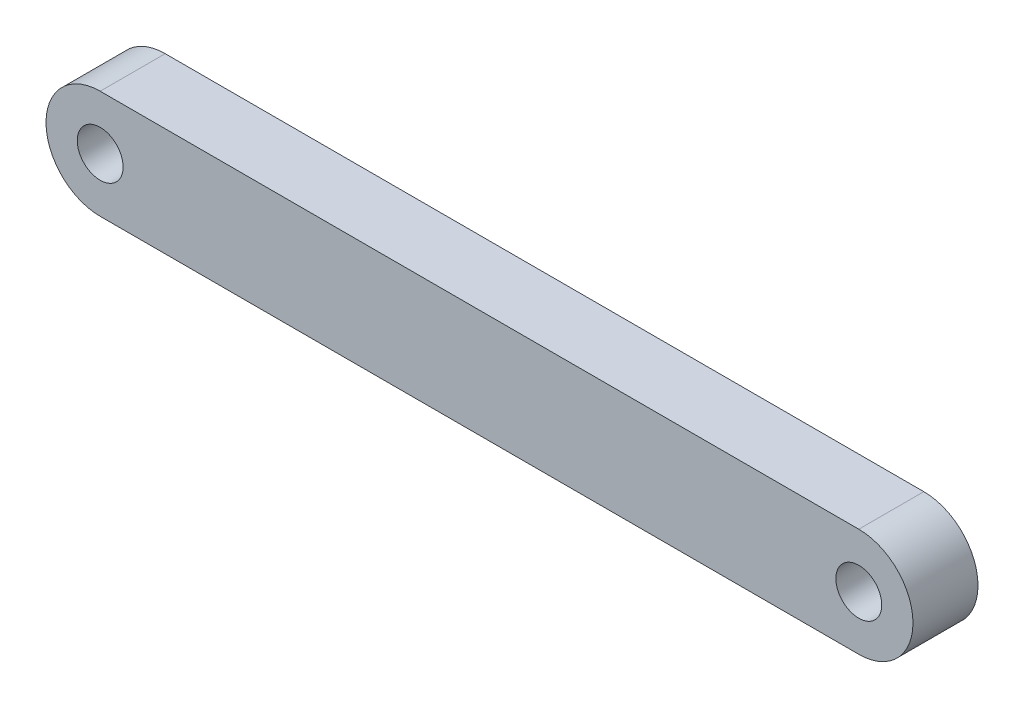
ISO-10303-21;
HEADER;
FILE_DESCRIPTION(('STEP AP214'),'2;1');
FILE_NAME('part.step','',(''),(''),'','','');
FILE_SCHEMA(('AUTOMOTIVE_DESIGN { 1 0 10303 214 1 1 1 1 }'));
ENDSEC;
DATA;
#1=APPLICATION_CONTEXT('core data for automotive mechanical design processes');
#2=APPLICATION_PROTOCOL_DEFINITION('international standard','automotive_design',2000,#1);
#3=PRODUCT_CONTEXT('',#1,'mechanical');
#4=PRODUCT('Part','Part','',(#3));
#5=PRODUCT_RELATED_PRODUCT_CATEGORY('part','',(#4));
#6=PRODUCT_DEFINITION_FORMATION('','',#4);
#7=PRODUCT_DEFINITION_CONTEXT('part definition',#1,'design');
#8=PRODUCT_DEFINITION('design','',#6,#7);
#9=PRODUCT_DEFINITION_SHAPE('','',#8);
#10=(LENGTH_UNIT() NAMED_UNIT(*) SI_UNIT(.MILLI.,.METRE.));
#11=(NAMED_UNIT(*) PLANE_ANGLE_UNIT() SI_UNIT($,.RADIAN.));
#12=(NAMED_UNIT(*) SI_UNIT($,.STERADIAN.) SOLID_ANGLE_UNIT());
#13=UNCERTAINTY_MEASURE_WITH_UNIT(LENGTH_MEASURE(1.E-05),#10,'distance_accuracy_value','');
#14=(GEOMETRIC_REPRESENTATION_CONTEXT(3) GLOBAL_UNCERTAINTY_ASSIGNED_CONTEXT((#13)) GLOBAL_UNIT_ASSIGNED_CONTEXT((#10,
#11,#12)) REPRESENTATION_CONTEXT('',''));
#15=CARTESIAN_POINT('',(0.,0.,0.));
#16=DIRECTION('',(0.,0.,1.));
#17=DIRECTION('',(1.,0.,0.));
#18=AXIS2_PLACEMENT_3D('',#15,#16,#17);
#19=CARTESIAN_POINT('',(52.5,0.,4.5));
#20=DIRECTION('',(0.,0.,1.));
#21=DIRECTION('',(1.,0.,0.));
#22=AXIS2_PLACEMENT_3D('',#19,#20,#21);
#23=PLANE('',#22);
#24=CARTESIAN_POINT('',(52.5,0.,4.5));
#25=DIRECTION('',(0.,0.,1.));
#26=DIRECTION('',(1.,0.,0.));
#27=AXIS2_PLACEMENT_3D('',#24,#25,#26);
#28=CIRCLE('',#27,3.175);
#29=CARTESIAN_POINT('',(55.675,0.,4.5));
#30=VERTEX_POINT('',#29);
#31=EDGE_CURVE('E110',#30,#30,#28,.T.);
#32=ORIENTED_EDGE('',*,*,#31,.F.);
#33=EDGE_LOOP('',(#32));
#34=FACE_BOUND('',#33,.T.);
#35=CARTESIAN_POINT('',(52.5,0.,4.5));
#36=DIRECTION('',(0.,0.,1.));
#37=DIRECTION('',(1.,0.,0.));
#38=AXIS2_PLACEMENT_3D('',#35,#36,#37);
#39=CIRCLE('',#38,7.5);
#40=CARTESIAN_POINT('',(52.5,-7.5,4.5));
#41=VERTEX_POINT('',#40);
#42=CARTESIAN_POINT('',(52.5,7.5,4.5));
#43=VERTEX_POINT('',#42);
#44=EDGE_CURVE('E95',#41,#43,#39,.T.);
#45=ORIENTED_EDGE('',*,*,#44,.T.);
#46=DIRECTION('',(-1.,0.,0.));
#47=VECTOR('',#46,1.);
#48=CARTESIAN_POINT('',(-52.5000000000001,7.49999999999956,4.5));
#49=LINE('',#48,#47);
#50=CARTESIAN_POINT('',(-52.5000000000001,7.49999999999956,4.5));
#51=VERTEX_POINT('',#50);
#52=EDGE_CURVE('E90',#43,#51,#49,.T.);
#53=ORIENTED_EDGE('',*,*,#52,.T.);
#54=CARTESIAN_POINT('',(-52.5,0.,4.5));
#55=DIRECTION('',(0.,0.,1.));
#56=DIRECTION('',(-1.,0.,0.));
#57=AXIS2_PLACEMENT_3D('',#54,#55,#56);
#58=CIRCLE('',#57,7.49999999999978);
#59=CARTESIAN_POINT('',(-52.5,-7.49999999999978,4.5));
#60=VERTEX_POINT('',#59);
#61=EDGE_CURVE('E93',#51,#60,#58,.T.);
#62=ORIENTED_EDGE('',*,*,#61,.T.);
#63=DIRECTION('',(1.,0.,0.));
#64=VECTOR('',#63,1.);
#65=CARTESIAN_POINT('',(-52.5,-7.5,4.5));
#66=LINE('',#65,#64);
#67=EDGE_CURVE('E60',#60,#41,#66,.T.);
#68=ORIENTED_EDGE('',*,*,#67,.T.);
#69=EDGE_LOOP('',(#45,#53,#62,#68));
#70=FACE_BOUND('',#69,.T.);
#71=CARTESIAN_POINT('',(-52.5,0.,4.5));
#72=DIRECTION('',(0.,0.,1.));
#73=DIRECTION('',(1.,0.,0.));
#74=AXIS2_PLACEMENT_3D('',#71,#72,#73);
#75=CIRCLE('',#74,3.175);
#76=CARTESIAN_POINT('',(-49.325,0.,4.5));
#77=VERTEX_POINT('',#76);
#78=EDGE_CURVE('E125',#77,#77,#75,.T.);
#79=ORIENTED_EDGE('',*,*,#78,.F.);
#80=EDGE_LOOP('',(#79));
#81=FACE_BOUND('',#80,.T.);
#82=ADVANCED_FACE('F43',(#34,#70,#81),#23,.T.);
#83=CARTESIAN_POINT('',(52.5,0.,-4.5));
#84=DIRECTION('',(0.,0.,1.));
#85=DIRECTION('',(1.,0.,0.));
#86=AXIS2_PLACEMENT_3D('',#83,#84,#85);
#87=PLANE('',#86);
#88=CARTESIAN_POINT('',(52.5,0.,-4.5));
#89=DIRECTION('',(0.,0.,1.));
#90=DIRECTION('',(1.,0.,0.));
#91=AXIS2_PLACEMENT_3D('',#88,#89,#90);
#92=CIRCLE('',#91,7.5);
#93=CARTESIAN_POINT('',(52.5,-7.5,-4.5));
#94=VERTEX_POINT('',#93);
#95=CARTESIAN_POINT('',(52.5,7.5,-4.5));
#96=VERTEX_POINT('',#95);
#97=EDGE_CURVE('E107',#94,#96,#92,.T.);
#98=ORIENTED_EDGE('',*,*,#97,.F.);
#99=DIRECTION('',(1.,0.,0.));
#100=VECTOR('',#99,1.);
#101=CARTESIAN_POINT('',(-52.5,-7.5,-4.5));
#102=LINE('',#101,#100);
#103=CARTESIAN_POINT('',(-52.5,-7.49999999999978,-4.5));
#104=VERTEX_POINT('',#103);
#105=EDGE_CURVE('E83',#104,#94,#102,.T.);
#106=ORIENTED_EDGE('',*,*,#105,.F.);
#107=CARTESIAN_POINT('',(-52.5,0.,-4.5));
#108=DIRECTION('',(0.,0.,1.));
#109=DIRECTION('',(-1.,0.,0.));
#110=AXIS2_PLACEMENT_3D('',#107,#108,#109);
#111=CIRCLE('',#110,7.49999999999978);
#112=CARTESIAN_POINT('',(-52.5000000000001,7.49999999999956,-4.5));
#113=VERTEX_POINT('',#112);
#114=EDGE_CURVE('E77',#113,#104,#111,.T.);
#115=ORIENTED_EDGE('',*,*,#114,.F.);
#116=DIRECTION('',(-1.,0.,0.));
#117=VECTOR('',#116,1.);
#118=CARTESIAN_POINT('',(-52.5000000000001,7.49999999999956,-4.5));
#119=LINE('',#118,#117);
#120=EDGE_CURVE('E99',#96,#113,#119,.T.);
#121=ORIENTED_EDGE('',*,*,#120,.F.);
#122=EDGE_LOOP('',(#98,#106,#115,#121));
#123=FACE_BOUND('',#122,.T.);
#124=CARTESIAN_POINT('',(52.5,0.,-4.5));
#125=DIRECTION('',(0.,0.,1.));
#126=DIRECTION('',(1.,0.,0.));
#127=AXIS2_PLACEMENT_3D('',#124,#125,#126);
#128=CIRCLE('',#127,3.175);
#129=CARTESIAN_POINT('',(55.675,0.,-4.5));
#130=VERTEX_POINT('',#129);
#131=EDGE_CURVE('E122',#130,#130,#128,.T.);
#132=ORIENTED_EDGE('',*,*,#131,.T.);
#133=EDGE_LOOP('',(#132));
#134=FACE_BOUND('',#133,.T.);
#135=CARTESIAN_POINT('',(-52.5,0.,-4.5));
#136=DIRECTION('',(0.,0.,1.));
#137=DIRECTION('',(1.,0.,0.));
#138=AXIS2_PLACEMENT_3D('',#135,#136,#137);
#139=CIRCLE('',#138,3.175);
#140=CARTESIAN_POINT('',(-49.325,0.,-4.5));
#141=VERTEX_POINT('',#140);
#142=EDGE_CURVE('E128',#141,#141,#139,.T.);
#143=ORIENTED_EDGE('',*,*,#142,.T.);
#144=EDGE_LOOP('',(#143));
#145=FACE_BOUND('',#144,.T.);
#146=ADVANCED_FACE('F118',(#123,#134,#145),#87,.F.);
#147=CARTESIAN_POINT('',(52.5,0.,4.5));
#148=DIRECTION('',(0.,0.,-1.));
#149=DIRECTION('',(-1.,0.,0.));
#150=AXIS2_PLACEMENT_3D('',#147,#148,#149);
#151=CYLINDRICAL_SURFACE('',#150,7.5);
#152=ORIENTED_EDGE('',*,*,#97,.T.);
#153=DIRECTION('',(0.,0.,-1.));
#154=VECTOR('',#153,1.);
#155=CARTESIAN_POINT('',(52.5,7.5,4.5));
#156=LINE('',#155,#154);
#157=EDGE_CURVE('E11',#43,#96,#156,.T.);
#158=ORIENTED_EDGE('',*,*,#157,.F.);
#159=ORIENTED_EDGE('',*,*,#44,.F.);
#160=DIRECTION('',(0.,0.,-1.));
#161=VECTOR('',#160,1.);
#162=CARTESIAN_POINT('',(52.5,-7.5,4.5));
#163=LINE('',#162,#161);
#164=EDGE_CURVE('E103',#41,#94,#163,.T.);
#165=ORIENTED_EDGE('',*,*,#164,.T.);
#166=EDGE_LOOP('',(#152,#158,#159,#165));
#167=FACE_BOUND('',#166,.T.);
#168=ADVANCED_FACE('F45',(#167),#151,.T.);
#169=CARTESIAN_POINT('',(-52.5000000000001,7.49999999999956,4.5));
#170=DIRECTION('',(0.,-1.,0.));
#171=DIRECTION('',(1.,0.,0.));
#172=AXIS2_PLACEMENT_3D('',#169,#170,#171);
#173=PLANE('',#172);
#174=ORIENTED_EDGE('',*,*,#120,.T.);
#175=DIRECTION('',(0.,0.,-1.));
#176=VECTOR('',#175,1.);
#177=CARTESIAN_POINT('',(-52.5000000000001,7.49999999999956,4.5));
#178=LINE('',#177,#176);
#179=EDGE_CURVE('E52',#51,#113,#178,.T.);
#180=ORIENTED_EDGE('',*,*,#179,.F.);
#181=ORIENTED_EDGE('',*,*,#52,.F.);
#182=ORIENTED_EDGE('',*,*,#157,.T.);
#183=EDGE_LOOP('',(#174,#180,#181,#182));
#184=FACE_BOUND('',#183,.T.);
#185=ADVANCED_FACE('F98',(#184),#173,.F.);
#186=CARTESIAN_POINT('',(-52.5,0.,4.5));
#187=DIRECTION('',(0.,0.,-1.));
#188=DIRECTION('',(-1.,0.,0.));
#189=AXIS2_PLACEMENT_3D('',#186,#187,#188);
#190=CYLINDRICAL_SURFACE('',#189,7.49999999999978);
#191=ORIENTED_EDGE('',*,*,#114,.T.);
#192=DIRECTION('',(0.,0.,-1.));
#193=VECTOR('',#192,1.);
#194=CARTESIAN_POINT('',(-52.5,-7.49999999999978,4.5));
#195=LINE('',#194,#193);
#196=EDGE_CURVE('E100',#60,#104,#195,.T.);
#197=ORIENTED_EDGE('',*,*,#196,.F.);
#198=ORIENTED_EDGE('',*,*,#61,.F.);
#199=ORIENTED_EDGE('',*,*,#179,.T.);
#200=EDGE_LOOP('',(#191,#197,#198,#199));
#201=FACE_BOUND('',#200,.T.);
#202=ADVANCED_FACE('F101',(#201),#190,.T.);
#203=CARTESIAN_POINT('',(-52.5,-7.5,4.5));
#204=DIRECTION('',(0.,1.,0.));
#205=DIRECTION('',(0.,0.,1.));
#206=AXIS2_PLACEMENT_3D('',#203,#204,#205);
#207=PLANE('',#206);
#208=ORIENTED_EDGE('',*,*,#105,.T.);
#209=ORIENTED_EDGE('',*,*,#164,.F.);
#210=ORIENTED_EDGE('',*,*,#67,.F.);
#211=ORIENTED_EDGE('',*,*,#196,.T.);
#212=EDGE_LOOP('',(#208,#209,#210,#211));
#213=FACE_BOUND('',#212,.T.);
#214=ADVANCED_FACE('F115',(#213),#207,.F.);
#215=CARTESIAN_POINT('',(52.5,0.,4.5));
#216=DIRECTION('',(0.,0.,-1.));
#217=DIRECTION('',(-1.,0.,0.));
#218=AXIS2_PLACEMENT_3D('',#215,#216,#217);
#219=CYLINDRICAL_SURFACE('',#218,3.175);
#220=ORIENTED_EDGE('',*,*,#31,.T.);
#221=EDGE_LOOP('',(#220));
#222=FACE_BOUND('',#221,.T.);
#223=ORIENTED_EDGE('',*,*,#131,.F.);
#224=EDGE_LOOP('',(#223));
#225=FACE_BOUND('',#224,.T.);
#226=ADVANCED_FACE('F145',(#222,#225),#219,.F.);
#227=CARTESIAN_POINT('',(-52.5,0.,4.5));
#228=DIRECTION('',(0.,0.,-1.));
#229=DIRECTION('',(-1.,0.,0.));
#230=AXIS2_PLACEMENT_3D('',#227,#228,#229);
#231=CYLINDRICAL_SURFACE('',#230,3.175);
#232=ORIENTED_EDGE('',*,*,#78,.T.);
#233=EDGE_LOOP('',(#232));
#234=FACE_BOUND('',#233,.T.);
#235=ORIENTED_EDGE('',*,*,#142,.F.);
#236=EDGE_LOOP('',(#235));
#237=FACE_BOUND('',#236,.T.);
#238=ADVANCED_FACE('F134',(#234,#237),#231,.F.);
#239=CLOSED_SHELL('',(#82,#146,#168,#185,#202,#214,#226,#238));
#240=MANIFOLD_SOLID_BREP('B2',#239);
#241=ADVANCED_BREP_SHAPE_REPRESENTATION('',(#18,#240),#14);
#242=SHAPE_DEFINITION_REPRESENTATION(#9,#241);
ENDSEC;
END-ISO-10303-21;
